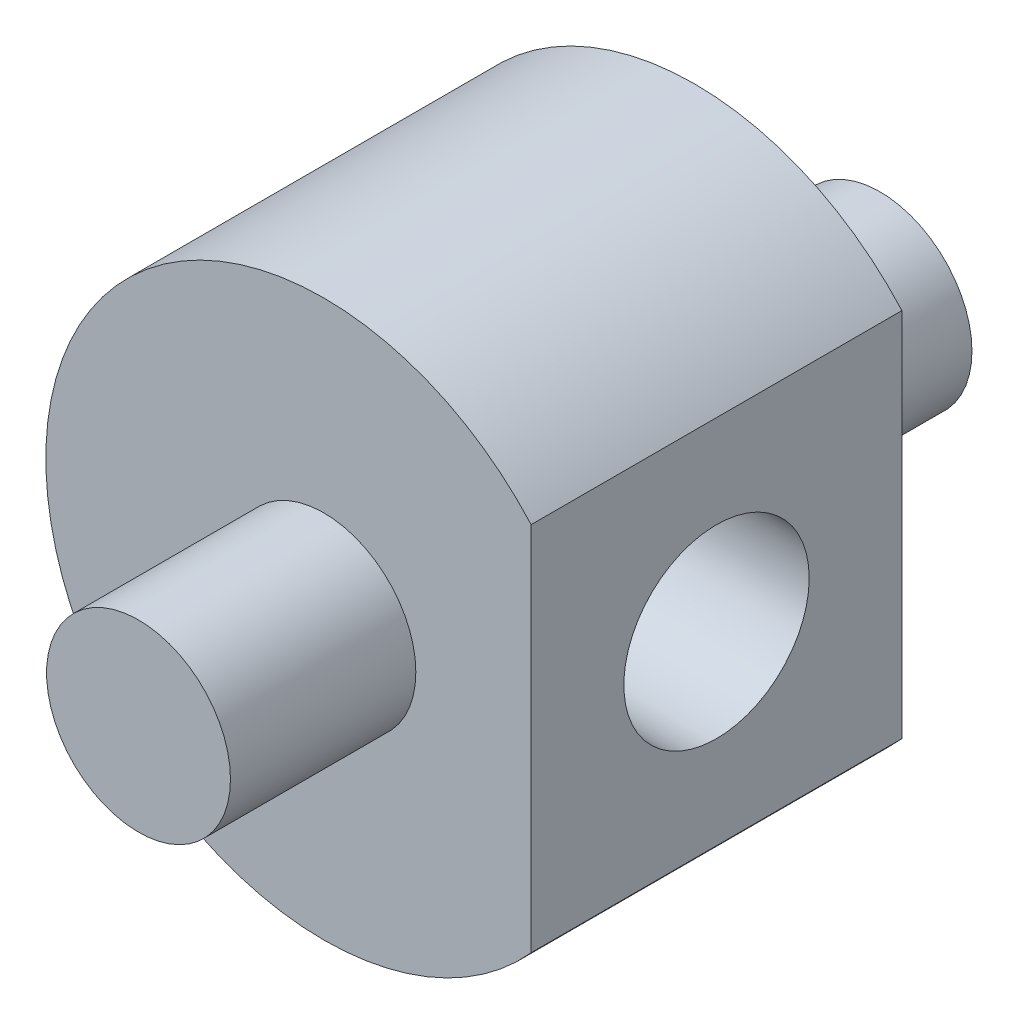
ISO-10303-21;
HEADER;
FILE_DESCRIPTION(('STEP AP214'),'2;1');
FILE_NAME('part.step','',(''),(''),'','','');
FILE_SCHEMA(('AUTOMOTIVE_DESIGN { 1 0 10303 214 1 1 1 1 }'));
ENDSEC;
DATA;
#1=APPLICATION_CONTEXT('core data for automotive mechanical design processes');
#2=APPLICATION_PROTOCOL_DEFINITION('international standard','automotive_design',2000,#1);
#3=PRODUCT_CONTEXT('',#1,'mechanical');
#4=PRODUCT('Part','Part','',(#3));
#5=PRODUCT_RELATED_PRODUCT_CATEGORY('part','',(#4));
#6=PRODUCT_DEFINITION_FORMATION('','',#4);
#7=PRODUCT_DEFINITION_CONTEXT('part definition',#1,'design');
#8=PRODUCT_DEFINITION('design','',#6,#7);
#9=PRODUCT_DEFINITION_SHAPE('','',#8);
#10=(LENGTH_UNIT() NAMED_UNIT(*) SI_UNIT(.MILLI.,.METRE.));
#11=(NAMED_UNIT(*) PLANE_ANGLE_UNIT() SI_UNIT($,.RADIAN.));
#12=(NAMED_UNIT(*) SI_UNIT($,.STERADIAN.) SOLID_ANGLE_UNIT());
#13=UNCERTAINTY_MEASURE_WITH_UNIT(LENGTH_MEASURE(1.E-05),#10,'distance_accuracy_value','');
#14=(GEOMETRIC_REPRESENTATION_CONTEXT(3) GLOBAL_UNCERTAINTY_ASSIGNED_CONTEXT((#13)) GLOBAL_UNIT_ASSIGNED_CONTEXT((#10,
#11,#12)) REPRESENTATION_CONTEXT('',''));
#15=CARTESIAN_POINT('',(0.,0.,0.));
#16=DIRECTION('',(0.,0.,1.));
#17=DIRECTION('',(1.,0.,0.));
#18=AXIS2_PLACEMENT_3D('',#15,#16,#17);
#19=CARTESIAN_POINT('',(-7.09951582856183,6.35,12.7));
#20=DIRECTION('',(0.,0.,-1.));
#21=DIRECTION('',(-1.,0.,0.));
#22=AXIS2_PLACEMENT_3D('',#19,#20,#21);
#23=CYLINDRICAL_SURFACE('',#22,9.525);
#24=CARTESIAN_POINT('',(-16.6245158285618,6.35,3.175));
#25=CARTESIAN_POINT('',(-16.6245163143668,6.52323867716535,3.17499919440204));
#26=CARTESIAN_POINT('',(-16.6197460104264,6.6964724926599,3.18922484495391));
#27=CARTESIAN_POINT('',(-16.601186252516,7.03783759077169,3.24557742049467));
#28=CARTESIAN_POINT('',(-16.5873958622302,7.20596834177725,3.28770724203783));
#29=CARTESIAN_POINT('',(-16.5522943545914,7.53215660666814,3.39826359774435));
#30=CARTESIAN_POINT('',(-16.5309958140164,7.69023044718816,3.46664617330819));
#31=CARTESIAN_POINT('',(-16.4830519800874,7.9926654243569,3.62756822376175));
#32=CARTESIAN_POINT('',(-16.4564056322638,8.13702384834389,3.72011246388326));
#33=CARTESIAN_POINT('',(-16.3995383271272,8.41292981819569,3.93009693042654));
#34=CARTESIAN_POINT('',(-16.369231746287,8.54393674844713,4.04822416877707));
#35=CARTESIAN_POINT('',(-16.3089308229259,8.78469379932912,4.30456071619335));
#36=CARTESIAN_POINT('',(-16.2789365505368,8.89443923892904,4.44277443589803));
#37=CARTESIAN_POINT('',(-16.2217141347153,9.09264419157345,4.74022774074876));
#38=CARTESIAN_POINT('',(-16.1945903255649,9.18040092485177,4.89995762364949));
#39=CARTESIAN_POINT('',(-16.1474817756024,9.32757492456177,5.23295909990589));
#40=CARTESIAN_POINT('',(-16.1274948566655,9.38700083920298,5.40622654199171));
#41=CARTESIAN_POINT('',(-16.0978247073646,9.4737982402916,5.75523747825206));
#42=CARTESIAN_POINT('',(-16.087816869247,9.50218269826287,5.93070063695278));
#43=CARTESIAN_POINT('',(-16.0782779265487,9.52925806658697,6.28416241944492));
#44=CARTESIAN_POINT('',(-16.0787435845335,9.52795815259498,6.46216024275168));
#45=CARTESIAN_POINT('',(-16.0898145550716,9.49648819425835,6.80699880165977));
#46=CARTESIAN_POINT('',(-16.099955532356,9.46764017430521,6.97397767926788));
#47=CARTESIAN_POINT('',(-16.1284747113163,9.3840495670469,7.3005741072517));
#48=CARTESIAN_POINT('',(-16.1468538992073,9.32930387942919,7.46019077375635));
#49=CARTESIAN_POINT('',(-16.190109506979,9.19460650934117,7.77053547995294));
#50=CARTESIAN_POINT('',(-16.2150857924933,9.11426310464556,7.92107898086574));
#51=CARTESIAN_POINT('',(-16.2686795633411,8.93092291251247,8.20696513378813));
#52=CARTESIAN_POINT('',(-16.2972980994091,8.82791958175572,8.34230337801348));
#53=CARTESIAN_POINT('',(-16.3567785296376,8.5958341312661,8.60136582416045));
#54=CARTESIAN_POINT('',(-16.3876795405781,8.46567125149229,8.7241148050663));
#55=CARTESIAN_POINT('',(-16.4469361223503,8.18622813465495,8.94629677165629));
#56=CARTESIAN_POINT('',(-16.4752914488955,8.03694606622309,9.04572752117227));
#57=CARTESIAN_POINT('',(-16.5266340055868,7.7214336714219,9.21923575324634));
#58=CARTESIAN_POINT('',(-16.5495651913171,7.55504990262187,9.29305193500682));
#59=CARTESIAN_POINT('',(-16.5870688353976,7.21127933968231,9.41134507730938));
#60=CARTESIAN_POINT('',(-16.6016441971042,7.03389639114198,9.45583222946942));
#61=CARTESIAN_POINT('',(-16.6203129880801,6.68141865875554,9.51247673962099));
#62=CARTESIAN_POINT('',(-16.6248333867827,6.50655797957089,9.52595189412349));
#63=CARTESIAN_POINT('',(-16.6241634891226,6.15703915287625,9.52394376132486));
#64=CARTESIAN_POINT('',(-16.6189748318766,5.98238097616011,9.50846536206389));
#65=CARTESIAN_POINT('',(-16.5997516133299,5.64349942448399,9.45003219293833));
#66=CARTESIAN_POINT('',(-16.5859776376422,5.47912033829937,9.40788629579285));
#67=CARTESIAN_POINT('',(-16.5512319654166,5.15983233150985,9.29832581381814));
#68=CARTESIAN_POINT('',(-16.5302593510438,5.00492462148517,9.23090800668978));
#69=CARTESIAN_POINT('',(-16.4825593969333,4.70443465895136,9.0707513789055));
#70=CARTESIAN_POINT('',(-16.455695197058,4.55920487948556,8.97739316632593));
#71=CARTESIAN_POINT('',(-16.3992576404032,4.28604416431951,8.76873357370719));
#72=CARTESIAN_POINT('',(-16.3696834576659,4.15811853224904,8.65342549209915));
#73=CARTESIAN_POINT('',(-16.309455751941,3.917148287715,8.39794246555408));
#74=CARTESIAN_POINT('',(-16.2788142430877,3.80504392264468,8.25687570450722));
#75=CARTESIAN_POINT('',(-16.2212899806688,3.60598236662265,7.95727527220043));
#76=CARTESIAN_POINT('',(-16.1944072584404,3.51902538531903,7.79874145533681));
#77=CARTESIAN_POINT('',(-16.1477067679383,3.37312974592805,7.46863817645458));
#78=CARTESIAN_POINT('',(-16.1278747337389,3.31413443037606,7.29709589863917));
#79=CARTESIAN_POINT('',(-16.0978097542916,3.22613443303905,6.94569778610989));
#80=CARTESIAN_POINT('',(-16.0875724848624,3.19711624052124,6.76584573484119));
#81=CARTESIAN_POINT('',(-16.078347847817,3.17094780313444,6.41287422007009));
#82=CARTESIAN_POINT('',(-16.0788095367348,3.17223693304583,6.23988356958934));
#83=CARTESIAN_POINT('',(-16.0895686454696,3.2028057183004,5.89672088712245));
#84=CARTESIAN_POINT('',(-16.0998654798891,3.23208370771899,5.72654868799259));
#85=CARTESIAN_POINT('',(-16.1287244752421,3.31669449331433,5.39706926996715));
#86=CARTESIAN_POINT('',(-16.1471259407755,3.37152187640074,5.23761708061072));
#87=CARTESIAN_POINT('',(-16.1900614910482,3.5052655137128,4.930052982971));
#88=CARTESIAN_POINT('',(-16.2145969367996,3.58418711484167,4.78194360097808));
#89=CARTESIAN_POINT('',(-16.2683706564888,3.76789730104761,4.49426434799476));
#90=CARTESIAN_POINT('',(-16.2977674231997,3.87366432922246,4.35534910647263));
#91=CARTESIAN_POINT('',(-16.3572873905551,4.10640884604432,4.09673484250516));
#92=CARTESIAN_POINT('',(-16.3874107945297,4.23339233186655,3.97704127219036));
#93=CARTESIAN_POINT('',(-16.4463992977479,4.51090805677681,3.75556649098186));
#94=CARTESIAN_POINT('',(-16.4751696007517,4.66216519463836,3.65466519589058));
#95=CARTESIAN_POINT('',(-16.5269160482923,4.98044039023397,3.4798303883992));
#96=CARTESIAN_POINT('',(-16.5498936736386,5.14745440492979,3.40588998169752));
#97=CARTESIAN_POINT('',(-16.586590931988,5.4848326701369,3.29018381684847));
#98=CARTESIAN_POINT('',(-16.6006783229769,5.6547138693774,3.24712816961378));
#99=CARTESIAN_POINT('',(-16.6196392528509,5.99973267916747,3.18954060885012));
#100=CARTESIAN_POINT('',(-16.6245153374498,6.17486882381923,3.1750008143985));
#101=CARTESIAN_POINT('',(-16.6245158285618,6.35,3.175));
#102=B_SPLINE_CURVE_WITH_KNOTS('',3,(#24,#25,#26,#27,#28,#29,#30,#31,#32,#33,#34,#35,#36,#37,
#38,#39,#40,#41,#42,#43,#44,#45,#46,#47,#48,#49,#50,#51,#52,#53,#54,#55,#56,#57,#58,#59,#60,#61,
#62,#63,#64,#65,#66,#67,#68,#69,#70,#71,#72,#73,#74,#75,#76,#77,#78,#79,#80,#81,#82,#83,#84,#85,
#86,#87,#88,#89,#90,#91,#92,#93,#94,#95,#96,#97,#98,#99,#100,#101),.UNSPECIFIED.,.T.,.F.,(4,2,2,
2,2,2,2,2,2,2,2,2,2,2,2,2,2,2,2,2,2,2,2,2,2,2,2,2,2,2,2,2,2,2,2,2,2,2,4),(0.,0.519071561632584,
1.03819701322438,1.55645698636312,2.07481924951214,2.6093637259775,3.14402575687908,
3.69406121814519,4.24392866899746,4.77526114230342,5.30642937910266,5.81332424300315,
6.32027980466155,6.8353994341754,7.35066800622308,7.8928374595109,8.43505888444013,
8.98265937939885,9.53006948685136,10.0537512658116,10.5773446429626,11.0857715158083,
11.5942632377703,12.1161301950386,12.638156741095,13.1839024764639,13.7296527614611,
14.274292439,14.8186865394104,15.3351123975402,15.8515075194062,16.3580948898033,
16.8647947620873,17.3936046174648,17.92256420318,18.4721392315144,19.0215736265905,
19.5464607283686,20.0712027467109),.UNSPECIFIED.);
#103=CARTESIAN_POINT('',(-16.6245158285618,6.35,3.175));
#104=VERTEX_POINT('',#103);
#105=EDGE_CURVE('E105',#104,#104,#102,.T.);
#106=ORIENTED_EDGE('',*,*,#105,.T.);
#107=EDGE_LOOP('',(#106));
#108=FACE_BOUND('',#107,.T.);
#109=CARTESIAN_POINT('',(-7.09951582856183,6.35,0.));
#110=DIRECTION('',(0.,0.,1.));
#111=DIRECTION('',(-1.,0.,0.));
#112=AXIS2_PLACEMENT_3D('',#109,#110,#111);
#113=CIRCLE('',#112,9.525);
#114=CARTESIAN_POINT('',(0.,12.7,0.));
#115=VERTEX_POINT('',#114);
#116=CARTESIAN_POINT('',(0.,0.,0.));
#117=VERTEX_POINT('',#116);
#118=EDGE_CURVE('E79',#115,#117,#113,.T.);
#119=ORIENTED_EDGE('',*,*,#118,.T.);
#120=DIRECTION('',(0.,0.,-1.));
#121=VECTOR('',#120,1.);
#122=CARTESIAN_POINT('',(0.,0.,12.7));
#123=LINE('',#122,#121);
#124=CARTESIAN_POINT('',(0.,0.,12.7));
#125=VERTEX_POINT('',#124);
#126=EDGE_CURVE('E53',#125,#117,#123,.T.);
#127=ORIENTED_EDGE('',*,*,#126,.F.);
#128=CARTESIAN_POINT('',(-7.09951582856183,6.35,12.7));
#129=DIRECTION('',(0.,0.,1.));
#130=DIRECTION('',(-1.,0.,0.));
#131=AXIS2_PLACEMENT_3D('',#128,#129,#130);
#132=CIRCLE('',#131,9.525);
#133=CARTESIAN_POINT('',(0.,12.7,12.7));
#134=VERTEX_POINT('',#133);
#135=EDGE_CURVE('E78',#134,#125,#132,.T.);
#136=ORIENTED_EDGE('',*,*,#135,.F.);
#137=DIRECTION('',(0.,0.,-1.));
#138=VECTOR('',#137,1.);
#139=CARTESIAN_POINT('',(0.,12.7,12.7));
#140=LINE('',#139,#138);
#141=EDGE_CURVE('E73',#134,#115,#140,.T.);
#142=ORIENTED_EDGE('',*,*,#141,.T.);
#143=EDGE_LOOP('',(#119,#127,#136,#142));
#144=FACE_BOUND('',#143,.T.);
#145=ADVANCED_FACE('F43',(#108,#144),#23,.T.);
#146=CARTESIAN_POINT('',(0.,0.,12.7));
#147=DIRECTION('',(-1.,0.,0.));
#148=DIRECTION('',(0.,0.,1.));
#149=AXIS2_PLACEMENT_3D('',#146,#147,#148);
#150=PLANE('',#149);
#151=CARTESIAN_POINT('',(0.,6.35,6.35));
#152=DIRECTION('',(1.,0.,0.));
#153=DIRECTION('',(0.,0.,-1.));
#154=AXIS2_PLACEMENT_3D('',#151,#152,#153);
#155=CIRCLE('',#154,3.175);
#156=CARTESIAN_POINT('',(0.,6.35,3.175));
#157=VERTEX_POINT('',#156);
#158=EDGE_CURVE('E113',#157,#157,#155,.T.);
#159=ORIENTED_EDGE('',*,*,#158,.F.);
#160=EDGE_LOOP('',(#159));
#161=FACE_BOUND('',#160,.T.);
#162=DIRECTION('',(0.,1.,0.));
#163=VECTOR('',#162,1.);
#164=CARTESIAN_POINT('',(0.,0.,0.));
#165=LINE('',#164,#163);
#166=EDGE_CURVE('E68',#117,#115,#165,.T.);
#167=ORIENTED_EDGE('',*,*,#166,.T.);
#168=ORIENTED_EDGE('',*,*,#141,.F.);
#169=DIRECTION('',(0.,1.,0.));
#170=VECTOR('',#169,1.);
#171=CARTESIAN_POINT('',(0.,0.,12.7));
#172=LINE('',#171,#170);
#173=EDGE_CURVE('E60',#125,#134,#172,.T.);
#174=ORIENTED_EDGE('',*,*,#173,.F.);
#175=ORIENTED_EDGE('',*,*,#126,.T.);
#176=EDGE_LOOP('',(#167,#168,#174,#175));
#177=FACE_BOUND('',#176,.T.);
#178=ADVANCED_FACE('F72',(#161,#177),#150,.F.);
#179=CARTESIAN_POINT('',(-7.09951582856183,6.35,12.7));
#180=DIRECTION('',(0.,0.,-1.));
#181=DIRECTION('',(-1.,0.,0.));
#182=AXIS2_PLACEMENT_3D('',#179,#180,#181);
#183=PLANE('',#182);
#184=CARTESIAN_POINT('',(-7.09951582856183,6.35,12.7));
#185=DIRECTION('',(0.,0.,-1.));
#186=DIRECTION('',(-1.,0.,0.));
#187=AXIS2_PLACEMENT_3D('',#184,#185,#186);
#188=CIRCLE('',#187,3.1496);
#189=CARTESIAN_POINT('',(-3.94991582856183,6.35,12.7));
#190=VERTEX_POINT('',#189);
#191=EDGE_CURVE('E86',#190,#190,#188,.T.);
#192=ORIENTED_EDGE('',*,*,#191,.T.);
#193=EDGE_LOOP('',(#192));
#194=FACE_BOUND('',#193,.T.);
#195=ORIENTED_EDGE('',*,*,#135,.T.);
#196=ORIENTED_EDGE('',*,*,#173,.T.);
#197=EDGE_LOOP('',(#195,#196));
#198=FACE_BOUND('',#197,.T.);
#199=ADVANCED_FACE('F132',(#194,#198),#183,.F.);
#200=CARTESIAN_POINT('',(-7.09951582856183,6.35,0.));
#201=DIRECTION('',(0.,0.,-1.));
#202=DIRECTION('',(-1.,0.,0.));
#203=AXIS2_PLACEMENT_3D('',#200,#201,#202);
#204=PLANE('',#203);
#205=CARTESIAN_POINT('',(-7.09951582856183,6.35,0.));
#206=DIRECTION('',(0.,0.,-1.));
#207=DIRECTION('',(-1.,0.,0.));
#208=AXIS2_PLACEMENT_3D('',#205,#206,#207);
#209=CIRCLE('',#208,3.1496);
#210=CARTESIAN_POINT('',(-3.94991582856183,6.35,0.));
#211=VERTEX_POINT('',#210);
#212=EDGE_CURVE('E11',#211,#211,#209,.T.);
#213=ORIENTED_EDGE('',*,*,#212,.F.);
#214=EDGE_LOOP('',(#213));
#215=FACE_BOUND('',#214,.T.);
#216=ORIENTED_EDGE('',*,*,#118,.F.);
#217=ORIENTED_EDGE('',*,*,#166,.F.);
#218=EDGE_LOOP('',(#216,#217));
#219=FACE_BOUND('',#218,.T.);
#220=ADVANCED_FACE('F84',(#215,#219),#204,.T.);
#221=CARTESIAN_POINT('',(-7.09951582856183,6.35,-6.35));
#222=DIRECTION('',(0.,0.,1.));
#223=DIRECTION('',(1.,0.,0.));
#224=AXIS2_PLACEMENT_3D('',#221,#222,#223);
#225=PLANE('',#224);
#226=CARTESIAN_POINT('',(-7.09951582856183,6.35,-6.35));
#227=DIRECTION('',(0.,0.,1.));
#228=DIRECTION('',(1.,0.,0.));
#229=AXIS2_PLACEMENT_3D('',#226,#227,#228);
#230=CIRCLE('',#229,3.1496);
#231=CARTESIAN_POINT('',(-3.94991582856183,6.35,-6.35));
#232=VERTEX_POINT('',#231);
#233=EDGE_CURVE('E90',#232,#232,#230,.T.);
#234=ORIENTED_EDGE('',*,*,#233,.F.);
#235=EDGE_LOOP('',(#234));
#236=FACE_BOUND('',#235,.T.);
#237=ADVANCED_FACE('F124',(#236),#225,.F.);
#238=CARTESIAN_POINT('',(-7.09951582856183,6.35,-6.35));
#239=DIRECTION('',(0.,0.,1.));
#240=DIRECTION('',(1.,0.,0.));
#241=AXIS2_PLACEMENT_3D('',#238,#239,#240);
#242=CYLINDRICAL_SURFACE('',#241,3.1496);
#243=CARTESIAN_POINT('',(-3.94991582856183,6.35,0.));
#244=CARTESIAN_POINT('',(-3.94991582856183,6.35,-0.0661458333333324));
#245=CARTESIAN_POINT('',(-3.94991582856183,6.35,-0.132291666666666));
#246=CARTESIAN_POINT('',(-3.94991582856183,6.35,-0.264583333333333));
#247=CARTESIAN_POINT('',(-3.94991582856183,6.35,-0.330729166666666));
#248=CARTESIAN_POINT('',(-3.94991582856183,6.35,-0.463020833333333));
#249=CARTESIAN_POINT('',(-3.94991582856183,6.35,-0.529166666666666));
#250=CARTESIAN_POINT('',(-3.94991582856183,6.35,-0.661458333333333));
#251=CARTESIAN_POINT('',(-3.94991582856183,6.35,-0.727604166666666));
#252=CARTESIAN_POINT('',(-3.94991582856183,6.35,-0.859895833333333));
#253=CARTESIAN_POINT('',(-3.94991582856183,6.35,-0.926041666666666));
#254=CARTESIAN_POINT('',(-3.94991582856183,6.35,-1.05833333333333));
#255=CARTESIAN_POINT('',(-3.94991582856183,6.35,-1.12447916666667));
#256=CARTESIAN_POINT('',(-3.94991582856183,6.35,-1.25677083333333));
#257=CARTESIAN_POINT('',(-3.94991582856183,6.35,-1.32291666666667));
#258=CARTESIAN_POINT('',(-3.94991582856183,6.35,-1.45520833333333));
#259=CARTESIAN_POINT('',(-3.94991582856183,6.35,-1.52135416666667));
#260=CARTESIAN_POINT('',(-3.94991582856183,6.35,-1.65364583333333));
#261=CARTESIAN_POINT('',(-3.94991582856183,6.35,-1.71979166666667));
#262=CARTESIAN_POINT('',(-3.94991582856183,6.35,-1.85208333333333));
#263=CARTESIAN_POINT('',(-3.94991582856183,6.35,-1.91822916666667));
#264=CARTESIAN_POINT('',(-3.94991582856183,6.35,-2.05052083333333));
#265=CARTESIAN_POINT('',(-3.94991582856183,6.35,-2.11666666666667));
#266=CARTESIAN_POINT('',(-3.94991582856183,6.35,-2.24895833333333));
#267=CARTESIAN_POINT('',(-3.94991582856183,6.35,-2.31510416666667));
#268=CARTESIAN_POINT('',(-3.94991582856183,6.35,-2.44739583333333));
#269=CARTESIAN_POINT('',(-3.94991582856183,6.35,-2.51354166666667));
#270=CARTESIAN_POINT('',(-3.94991582856183,6.35,-2.64583333333333));
#271=CARTESIAN_POINT('',(-3.94991582856183,6.35,-2.71197916666667));
#272=CARTESIAN_POINT('',(-3.94991582856183,6.35,-2.84427083333333));
#273=CARTESIAN_POINT('',(-3.94991582856183,6.35,-2.91041666666667));
#274=CARTESIAN_POINT('',(-3.94991582856183,6.35,-3.04270833333333));
#275=CARTESIAN_POINT('',(-3.94991582856183,6.35,-3.10885416666667));
#276=CARTESIAN_POINT('',(-3.94991582856183,6.35,-3.24114583333333));
#277=CARTESIAN_POINT('',(-3.94991582856183,6.35,-3.30729166666667));
#278=CARTESIAN_POINT('',(-3.94991582856183,6.35,-3.43958333333333));
#279=CARTESIAN_POINT('',(-3.94991582856183,6.35,-3.50572916666667));
#280=CARTESIAN_POINT('',(-3.94991582856183,6.35,-3.63802083333333));
#281=CARTESIAN_POINT('',(-3.94991582856183,6.35,-3.70416666666667));
#282=CARTESIAN_POINT('',(-3.94991582856183,6.35,-3.83645833333333));
#283=CARTESIAN_POINT('',(-3.94991582856183,6.35,-3.90260416666667));
#284=CARTESIAN_POINT('',(-3.94991582856183,6.35,-4.03489583333333));
#285=CARTESIAN_POINT('',(-3.94991582856183,6.35,-4.10104166666667));
#286=CARTESIAN_POINT('',(-3.94991582856183,6.35,-4.23333333333333));
#287=CARTESIAN_POINT('',(-3.94991582856183,6.35,-4.29947916666667));
#288=CARTESIAN_POINT('',(-3.94991582856183,6.35,-4.43177083333333));
#289=CARTESIAN_POINT('',(-3.94991582856183,6.35,-4.49791666666667));
#290=CARTESIAN_POINT('',(-3.94991582856183,6.35,-4.63020833333333));
#291=CARTESIAN_POINT('',(-3.94991582856183,6.35,-4.69635416666667));
#292=CARTESIAN_POINT('',(-3.94991582856183,6.35,-4.82864583333333));
#293=CARTESIAN_POINT('',(-3.94991582856183,6.35,-4.89479166666667));
#294=CARTESIAN_POINT('',(-3.94991582856183,6.35,-5.02708333333333));
#295=CARTESIAN_POINT('',(-3.94991582856183,6.35,-5.09322916666667));
#296=CARTESIAN_POINT('',(-3.94991582856183,6.35,-5.22552083333333));
#297=CARTESIAN_POINT('',(-3.94991582856183,6.35,-5.29166666666667));
#298=CARTESIAN_POINT('',(-3.94991582856183,6.35,-5.42395833333333));
#299=CARTESIAN_POINT('',(-3.94991582856183,6.35,-5.49010416666667));
#300=CARTESIAN_POINT('',(-3.94991582856183,6.35,-5.62239583333333));
#301=CARTESIAN_POINT('',(-3.94991582856183,6.35,-5.68854166666667));
#302=CARTESIAN_POINT('',(-3.94991582856183,6.35,-5.82083333333333));
#303=CARTESIAN_POINT('',(-3.94991582856183,6.35,-5.88697916666667));
#304=CARTESIAN_POINT('',(-3.94991582856183,6.35,-6.01927083333333));
#305=CARTESIAN_POINT('',(-3.94991582856183,6.35,-6.08541666666667));
#306=CARTESIAN_POINT('',(-3.94991582856183,6.35,-6.21770833333333));
#307=CARTESIAN_POINT('',(-3.94991582856183,6.35,-6.28385416666667));
#308=CARTESIAN_POINT('',(-3.94991582856183,6.35,-6.35));
#309=B_SPLINE_CURVE_WITH_KNOTS('',3,(#243,#244,#245,#246,#247,#248,#249,#250,#251,#252,#253,
#254,#255,#256,#257,#258,#259,#260,#261,#262,#263,#264,#265,#266,#267,#268,#269,#270,#271,#272,
#273,#274,#275,#276,#277,#278,#279,#280,#281,#282,#283,#284,#285,#286,#287,#288,#289,#290,#291,
#292,#293,#294,#295,#296,#297,#298,#299,#300,#301,#302,#303,#304,#305,#306,#307,#308),
.UNSPECIFIED.,.F.,.F.,(4,2,2,2,2,2,2,2,2,2,2,2,2,2,2,2,2,2,2,2,2,2,2,2,2,2,2,2,2,2,2,2,4),(0.,
0.1984375,0.396875000000001,0.5953125,0.79375,0.9921875,1.190625,1.3890625,1.5875,1.7859375,
1.984375,2.1828125,2.38125,2.5796875,2.778125,2.9765625,3.175,3.3734375,3.571875,3.7703125,
3.96875,4.1671875,4.365625,4.5640625,4.7625,4.9609375,5.159375,5.3578125,5.55625,5.7546875,
5.953125,6.1515625,6.35),.UNSPECIFIED.);
#310=EDGE_CURVE('BSEAM127',#211,#232,#309,.T.);
#311=ORIENTED_EDGE('',*,*,#212,.T.);
#312=ORIENTED_EDGE('',*,*,#233,.T.);
#313=ORIENTED_EDGE('',*,*,#310,.T.);
#314=ORIENTED_EDGE('',*,*,#310,.F.);
#315=EDGE_LOOP('',(#311,#313,#312,#314));
#316=FACE_BOUND('',#315,.T.);
#317=ADVANCED_FACE('F127',(#316),#242,.T.);
#318=CARTESIAN_POINT('',(-7.09951582856183,6.35,19.05));
#319=DIRECTION('',(0.,0.,1.));
#320=DIRECTION('',(1.,0.,0.));
#321=AXIS2_PLACEMENT_3D('',#318,#319,#320);
#322=CIRCLE('',#321,3.1496);
#323=CARTESIAN_POINT('',(-3.94991582856183,6.35,19.05));
#324=VERTEX_POINT('',#323);
#325=EDGE_CURVE('E101',#324,#324,#322,.T.);
#326=CARTESIAN_POINT('',(-3.94991582856183,6.35,19.05));
#327=CARTESIAN_POINT('',(-3.94991582856183,6.35,18.9838541666667));
#328=CARTESIAN_POINT('',(-3.94991582856183,6.35,18.9177083333333));
#329=CARTESIAN_POINT('',(-3.94991582856183,6.35,18.7854166666667));
#330=CARTESIAN_POINT('',(-3.94991582856183,6.35,18.7192708333333));
#331=CARTESIAN_POINT('',(-3.94991582856183,6.35,18.5869791666667));
#332=CARTESIAN_POINT('',(-3.94991582856183,6.35,18.5208333333333));
#333=CARTESIAN_POINT('',(-3.94991582856183,6.35,18.3885416666667));
#334=CARTESIAN_POINT('',(-3.94991582856183,6.35,18.3223958333333));
#335=CARTESIAN_POINT('',(-3.94991582856183,6.35,18.1901041666667));
#336=CARTESIAN_POINT('',(-3.94991582856183,6.35,18.1239583333333));
#337=CARTESIAN_POINT('',(-3.94991582856183,6.35,17.9916666666667));
#338=CARTESIAN_POINT('',(-3.94991582856183,6.35,17.9255208333333));
#339=CARTESIAN_POINT('',(-3.94991582856183,6.35,17.7932291666667));
#340=CARTESIAN_POINT('',(-3.94991582856183,6.35,17.7270833333333));
#341=CARTESIAN_POINT('',(-3.94991582856183,6.35,17.5947916666667));
#342=CARTESIAN_POINT('',(-3.94991582856183,6.35,17.5286458333333));
#343=CARTESIAN_POINT('',(-3.94991582856183,6.35,17.3963541666667));
#344=CARTESIAN_POINT('',(-3.94991582856183,6.35,17.3302083333333));
#345=CARTESIAN_POINT('',(-3.94991582856183,6.35,17.1979166666667));
#346=CARTESIAN_POINT('',(-3.94991582856183,6.35,17.1317708333333));
#347=CARTESIAN_POINT('',(-3.94991582856183,6.35,16.9994791666667));
#348=CARTESIAN_POINT('',(-3.94991582856183,6.35,16.9333333333333));
#349=CARTESIAN_POINT('',(-3.94991582856183,6.35,16.8010416666667));
#350=CARTESIAN_POINT('',(-3.94991582856183,6.35,16.7348958333333));
#351=CARTESIAN_POINT('',(-3.94991582856183,6.35,16.6026041666667));
#352=CARTESIAN_POINT('',(-3.94991582856183,6.35,16.5364583333333));
#353=CARTESIAN_POINT('',(-3.94991582856183,6.35,16.4041666666667));
#354=CARTESIAN_POINT('',(-3.94991582856183,6.35,16.3380208333333));
#355=CARTESIAN_POINT('',(-3.94991582856183,6.35,16.2057291666667));
#356=CARTESIAN_POINT('',(-3.94991582856183,6.35,16.1395833333333));
#357=CARTESIAN_POINT('',(-3.94991582856183,6.35,16.0072916666667));
#358=CARTESIAN_POINT('',(-3.94991582856183,6.35,15.9411458333333));
#359=CARTESIAN_POINT('',(-3.94991582856183,6.35,15.8088541666667));
#360=CARTESIAN_POINT('',(-3.94991582856183,6.35,15.7427083333333));
#361=CARTESIAN_POINT('',(-3.94991582856183,6.35,15.6104166666667));
#362=CARTESIAN_POINT('',(-3.94991582856183,6.35,15.5442708333333));
#363=CARTESIAN_POINT('',(-3.94991582856183,6.35,15.4119791666667));
#364=CARTESIAN_POINT('',(-3.94991582856183,6.35,15.3458333333333));
#365=CARTESIAN_POINT('',(-3.94991582856183,6.35,15.2135416666667));
#366=CARTESIAN_POINT('',(-3.94991582856183,6.35,15.1473958333333));
#367=CARTESIAN_POINT('',(-3.94991582856183,6.35,15.0151041666667));
#368=CARTESIAN_POINT('',(-3.94991582856183,6.35,14.9489583333333));
#369=CARTESIAN_POINT('',(-3.94991582856183,6.35,14.8166666666667));
#370=CARTESIAN_POINT('',(-3.94991582856183,6.35,14.7505208333333));
#371=CARTESIAN_POINT('',(-3.94991582856183,6.35,14.6182291666667));
#372=CARTESIAN_POINT('',(-3.94991582856183,6.35,14.5520833333333));
#373=CARTESIAN_POINT('',(-3.94991582856183,6.35,14.4197916666667));
#374=CARTESIAN_POINT('',(-3.94991582856183,6.35,14.3536458333333));
#375=CARTESIAN_POINT('',(-3.94991582856183,6.35,14.2213541666667));
#376=CARTESIAN_POINT('',(-3.94991582856183,6.35,14.1552083333333));
#377=CARTESIAN_POINT('',(-3.94991582856183,6.35,14.0229166666667));
#378=CARTESIAN_POINT('',(-3.94991582856183,6.35,13.9567708333333));
#379=CARTESIAN_POINT('',(-3.94991582856183,6.35,13.8244791666667));
#380=CARTESIAN_POINT('',(-3.94991582856183,6.35,13.7583333333333));
#381=CARTESIAN_POINT('',(-3.94991582856183,6.35,13.6260416666667));
#382=CARTESIAN_POINT('',(-3.94991582856183,6.35,13.5598958333333));
#383=CARTESIAN_POINT('',(-3.94991582856183,6.35,13.4276041666667));
#384=CARTESIAN_POINT('',(-3.94991582856183,6.35,13.3614583333333));
#385=CARTESIAN_POINT('',(-3.94991582856183,6.35,13.2291666666667));
#386=CARTESIAN_POINT('',(-3.94991582856183,6.35,13.1630208333333));
#387=CARTESIAN_POINT('',(-3.94991582856183,6.35,13.0307291666667));
#388=CARTESIAN_POINT('',(-3.94991582856183,6.35,12.9645833333333));
#389=CARTESIAN_POINT('',(-3.94991582856183,6.35,12.8322916666667));
#390=CARTESIAN_POINT('',(-3.94991582856183,6.35,12.7661458333333));
#391=CARTESIAN_POINT('',(-3.94991582856183,6.35,12.7));
#392=B_SPLINE_CURVE_WITH_KNOTS('',3,(#326,#327,#328,#329,#330,#331,#332,#333,#334,#335,#336,
#337,#338,#339,#340,#341,#342,#343,#344,#345,#346,#347,#348,#349,#350,#351,#352,#353,#354,#355,
#356,#357,#358,#359,#360,#361,#362,#363,#364,#365,#366,#367,#368,#369,#370,#371,#372,#373,#374,
#375,#376,#377,#378,#379,#380,#381,#382,#383,#384,#385,#386,#387,#388,#389,#390,#391),
.UNSPECIFIED.,.F.,.F.,(4,2,2,2,2,2,2,2,2,2,2,2,2,2,2,2,2,2,2,2,2,2,2,2,2,2,2,2,2,2,2,2,4),(0.,
0.198437499999999,0.396874999999998,0.5953125,0.793749999999999,0.992187499999998,1.190625,
1.3890625,1.5875,1.7859375,1.984375,2.1828125,2.38125,2.5796875,2.778125,2.9765625,3.175,
3.3734375,3.571875,3.7703125,3.96875,4.1671875,4.365625,4.5640625,4.7625,4.96093749999999,
5.15937499999999,5.3578125,5.55625,5.75468749999999,5.953125,6.1515625,6.34999999999999),.UNSPECIFIED.);
#393=EDGE_CURVE('BSEAM122',#324,#190,#392,.T.);
#394=ORIENTED_EDGE('',*,*,#325,.F.);
#395=ORIENTED_EDGE('',*,*,#191,.F.);
#396=ORIENTED_EDGE('',*,*,#393,.T.);
#397=ORIENTED_EDGE('',*,*,#393,.F.);
#398=EDGE_LOOP('',(#394,#396,#395,#397));
#399=FACE_BOUND('',#398,.T.);
#400=ADVANCED_FACE('F122',(#399),#242,.T.);
#401=CARTESIAN_POINT('',(-7.09951582856183,6.35,19.05));
#402=DIRECTION('',(0.,0.,1.));
#403=DIRECTION('',(1.,0.,0.));
#404=AXIS2_PLACEMENT_3D('',#401,#402,#403);
#405=PLANE('',#404);
#406=ORIENTED_EDGE('',*,*,#325,.T.);
#407=EDGE_LOOP('',(#406));
#408=FACE_BOUND('',#407,.T.);
#409=ADVANCED_FACE('F118',(#408),#405,.T.);
#410=CARTESIAN_POINT('',(-16.6245158285618,6.35,6.35));
#411=DIRECTION('',(1.,0.,0.));
#412=DIRECTION('',(0.,0.,-1.));
#413=AXIS2_PLACEMENT_3D('',#410,#411,#412);
#414=CYLINDRICAL_SURFACE('',#413,3.175);
#415=ORIENTED_EDGE('',*,*,#158,.T.);
#416=EDGE_LOOP('',(#415));
#417=FACE_BOUND('',#416,.T.);
#418=ORIENTED_EDGE('',*,*,#105,.F.);
#419=EDGE_LOOP('',(#418));
#420=FACE_BOUND('',#419,.T.);
#421=ADVANCED_FACE('F114',(#417,#420),#414,.F.);
#422=CLOSED_SHELL('',(#145,#178,#199,#220,#237,#317,#400,#409,#421));
#423=MANIFOLD_SOLID_BREP('B2',#422);
#424=ADVANCED_BREP_SHAPE_REPRESENTATION('',(#18,#423),#14);
#425=SHAPE_DEFINITION_REPRESENTATION(#9,#424);
ENDSEC;
END-ISO-10303-21;
